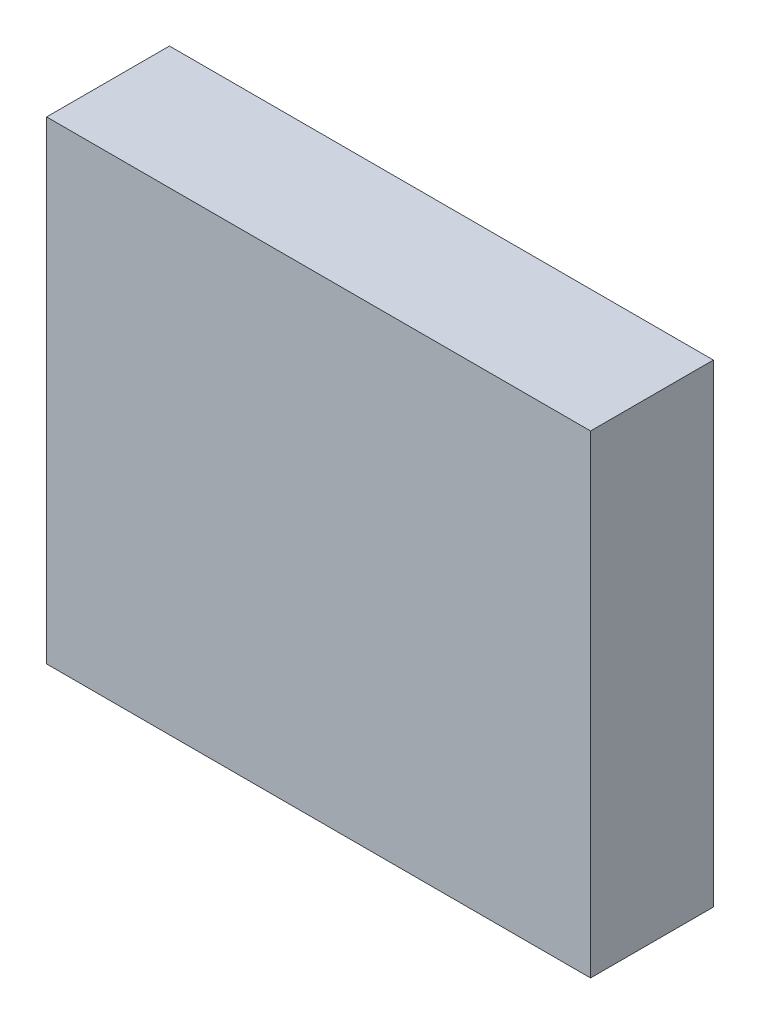
ISO-10303-21;
HEADER;
FILE_DESCRIPTION(('STEP AP214'),'2;1');
FILE_NAME('part.step','',(''),(''),'','','');
FILE_SCHEMA(('AUTOMOTIVE_DESIGN { 1 0 10303 214 1 1 1 1 }'));
ENDSEC;
DATA;
#1=APPLICATION_CONTEXT('core data for automotive mechanical design processes');
#2=APPLICATION_PROTOCOL_DEFINITION('international standard','automotive_design',2000,#1);
#3=PRODUCT_CONTEXT('',#1,'mechanical');
#4=PRODUCT('Part','Part','',(#3));
#5=PRODUCT_RELATED_PRODUCT_CATEGORY('part','',(#4));
#6=PRODUCT_DEFINITION_FORMATION('','',#4);
#7=PRODUCT_DEFINITION_CONTEXT('part definition',#1,'design');
#8=PRODUCT_DEFINITION('design','',#6,#7);
#9=PRODUCT_DEFINITION_SHAPE('','',#8);
#10=(LENGTH_UNIT() NAMED_UNIT(*) SI_UNIT(.MILLI.,.METRE.));
#11=(NAMED_UNIT(*) PLANE_ANGLE_UNIT() SI_UNIT($,.RADIAN.));
#12=(NAMED_UNIT(*) SI_UNIT($,.STERADIAN.) SOLID_ANGLE_UNIT());
#13=UNCERTAINTY_MEASURE_WITH_UNIT(LENGTH_MEASURE(1.E-05),#10,'distance_accuracy_value','');
#14=(GEOMETRIC_REPRESENTATION_CONTEXT(3) GLOBAL_UNCERTAINTY_ASSIGNED_CONTEXT((#13)) GLOBAL_UNIT_ASSIGNED_CONTEXT((#10,
#11,#12)) REPRESENTATION_CONTEXT('',''));
#15=CARTESIAN_POINT('',(0.,0.,0.));
#16=DIRECTION('',(0.,0.,1.));
#17=DIRECTION('',(1.,0.,0.));
#18=AXIS2_PLACEMENT_3D('',#15,#16,#17);
#19=CARTESIAN_POINT('',(155.,-135.,70.));
#20=DIRECTION('',(-1.,0.,0.));
#21=DIRECTION('',(0.,0.,1.));
#22=AXIS2_PLACEMENT_3D('',#19,#20,#21);
#23=PLANE('',#22);
#24=DIRECTION('',(0.,1.,0.));
#25=VECTOR('',#24,1.);
#26=CARTESIAN_POINT('',(155.,-135.,0.));
#27=LINE('',#26,#25);
#28=CARTESIAN_POINT('',(155.,-135.,0.));
#29=VERTEX_POINT('',#28);
#30=CARTESIAN_POINT('',(155.,135.,0.));
#31=VERTEX_POINT('',#30);
#32=EDGE_CURVE('E95',#29,#31,#27,.T.);
#33=ORIENTED_EDGE('',*,*,#32,.T.);
#34=DIRECTION('',(0.,0.,-1.));
#35=VECTOR('',#34,1.);
#36=CARTESIAN_POINT('',(155.,135.,70.));
#37=LINE('',#36,#35);
#38=CARTESIAN_POINT('',(155.,135.,70.));
#39=VERTEX_POINT('',#38);
#40=EDGE_CURVE('E11',#39,#31,#37,.T.);
#41=ORIENTED_EDGE('',*,*,#40,.F.);
#42=DIRECTION('',(0.,1.,0.));
#43=VECTOR('',#42,1.);
#44=CARTESIAN_POINT('',(155.,-135.,70.));
#45=LINE('',#44,#43);
#46=CARTESIAN_POINT('',(155.,-135.,70.));
#47=VERTEX_POINT('',#46);
#48=EDGE_CURVE('E83',#47,#39,#45,.T.);
#49=ORIENTED_EDGE('',*,*,#48,.F.);
#50=DIRECTION('',(0.,0.,-1.));
#51=VECTOR('',#50,1.);
#52=CARTESIAN_POINT('',(155.,-135.,70.));
#53=LINE('',#52,#51);
#54=EDGE_CURVE('E91',#47,#29,#53,.T.);
#55=ORIENTED_EDGE('',*,*,#54,.T.);
#56=EDGE_LOOP('',(#33,#41,#49,#55));
#57=FACE_BOUND('',#56,.T.);
#58=ADVANCED_FACE('F32',(#57),#23,.F.);
#59=CARTESIAN_POINT('',(-155.,135.,70.));
#60=DIRECTION('',(0.,-1.,0.));
#61=DIRECTION('',(0.,0.,-1.));
#62=AXIS2_PLACEMENT_3D('',#59,#60,#61);
#63=PLANE('',#62);
#64=DIRECTION('',(-1.,0.,0.));
#65=VECTOR('',#64,1.);
#66=CARTESIAN_POINT('',(-155.,135.,0.));
#67=LINE('',#66,#65);
#68=CARTESIAN_POINT('',(-155.,135.,0.));
#69=VERTEX_POINT('',#68);
#70=EDGE_CURVE('E87',#31,#69,#67,.T.);
#71=ORIENTED_EDGE('',*,*,#70,.T.);
#72=DIRECTION('',(0.,0.,-1.));
#73=VECTOR('',#72,1.);
#74=CARTESIAN_POINT('',(-155.,135.,70.));
#75=LINE('',#74,#73);
#76=CARTESIAN_POINT('',(-155.,135.,70.));
#77=VERTEX_POINT('',#76);
#78=EDGE_CURVE('E40',#77,#69,#75,.T.);
#79=ORIENTED_EDGE('',*,*,#78,.F.);
#80=DIRECTION('',(-1.,0.,0.));
#81=VECTOR('',#80,1.);
#82=CARTESIAN_POINT('',(-155.,135.,70.));
#83=LINE('',#82,#81);
#84=EDGE_CURVE('E78',#39,#77,#83,.T.);
#85=ORIENTED_EDGE('',*,*,#84,.F.);
#86=ORIENTED_EDGE('',*,*,#40,.T.);
#87=EDGE_LOOP('',(#71,#79,#85,#86));
#88=FACE_BOUND('',#87,.T.);
#89=ADVANCED_FACE('F86',(#88),#63,.F.);
#90=CARTESIAN_POINT('',(-155.,-135.,70.));
#91=DIRECTION('',(1.,0.,0.));
#92=DIRECTION('',(0.,0.,-1.));
#93=AXIS2_PLACEMENT_3D('',#90,#91,#92);
#94=PLANE('',#93);
#95=DIRECTION('',(0.,-1.,0.));
#96=VECTOR('',#95,1.);
#97=CARTESIAN_POINT('',(-155.,-135.,0.));
#98=LINE('',#97,#96);
#99=CARTESIAN_POINT('',(-155.,-135.,0.));
#100=VERTEX_POINT('',#99);
#101=EDGE_CURVE('E65',#69,#100,#98,.T.);
#102=ORIENTED_EDGE('',*,*,#101,.T.);
#103=DIRECTION('',(0.,0.,-1.));
#104=VECTOR('',#103,1.);
#105=CARTESIAN_POINT('',(-155.,-135.,70.));
#106=LINE('',#105,#104);
#107=CARTESIAN_POINT('',(-155.,-135.,70.));
#108=VERTEX_POINT('',#107);
#109=EDGE_CURVE('E88',#108,#100,#106,.T.);
#110=ORIENTED_EDGE('',*,*,#109,.F.);
#111=DIRECTION('',(0.,-1.,0.));
#112=VECTOR('',#111,1.);
#113=CARTESIAN_POINT('',(-155.,-135.,70.));
#114=LINE('',#113,#112);
#115=EDGE_CURVE('E81',#77,#108,#114,.T.);
#116=ORIENTED_EDGE('',*,*,#115,.F.);
#117=ORIENTED_EDGE('',*,*,#78,.T.);
#118=EDGE_LOOP('',(#102,#110,#116,#117));
#119=FACE_BOUND('',#118,.T.);
#120=ADVANCED_FACE('F89',(#119),#94,.F.);
#121=CARTESIAN_POINT('',(-155.,-135.,70.));
#122=DIRECTION('',(0.,1.,0.));
#123=DIRECTION('',(0.,0.,1.));
#124=AXIS2_PLACEMENT_3D('',#121,#122,#123);
#125=PLANE('',#124);
#126=DIRECTION('',(1.,0.,0.));
#127=VECTOR('',#126,1.);
#128=CARTESIAN_POINT('',(-155.,-135.,0.));
#129=LINE('',#128,#127);
#130=EDGE_CURVE('E71',#100,#29,#129,.T.);
#131=ORIENTED_EDGE('',*,*,#130,.T.);
#132=ORIENTED_EDGE('',*,*,#54,.F.);
#133=DIRECTION('',(1.,0.,0.));
#134=VECTOR('',#133,1.);
#135=CARTESIAN_POINT('',(-155.,-135.,70.));
#136=LINE('',#135,#134);
#137=EDGE_CURVE('E48',#108,#47,#136,.T.);
#138=ORIENTED_EDGE('',*,*,#137,.F.);
#139=ORIENTED_EDGE('',*,*,#109,.T.);
#140=EDGE_LOOP('',(#131,#132,#138,#139));
#141=FACE_BOUND('',#140,.T.);
#142=ADVANCED_FACE('F102',(#141),#125,.F.);
#143=CARTESIAN_POINT('',(0.,0.,70.));
#144=DIRECTION('',(0.,0.,-1.));
#145=DIRECTION('',(-1.,0.,0.));
#146=AXIS2_PLACEMENT_3D('',#143,#144,#145);
#147=PLANE('',#146);
#148=ORIENTED_EDGE('',*,*,#48,.T.);
#149=ORIENTED_EDGE('',*,*,#84,.T.);
#150=ORIENTED_EDGE('',*,*,#115,.T.);
#151=ORIENTED_EDGE('',*,*,#137,.T.);
#152=EDGE_LOOP('',(#148,#149,#150,#151));
#153=FACE_BOUND('',#152,.T.);
#154=ADVANCED_FACE('F79',(#153),#147,.F.);
#155=CARTESIAN_POINT('',(0.,0.,0.));
#156=DIRECTION('',(0.,0.,-1.));
#157=DIRECTION('',(-1.,0.,0.));
#158=AXIS2_PLACEMENT_3D('',#155,#156,#157);
#159=PLANE('',#158);
#160=ORIENTED_EDGE('',*,*,#32,.F.);
#161=ORIENTED_EDGE('',*,*,#130,.F.);
#162=ORIENTED_EDGE('',*,*,#101,.F.);
#163=ORIENTED_EDGE('',*,*,#70,.F.);
#164=EDGE_LOOP('',(#160,#161,#162,#163));
#165=FACE_BOUND('',#164,.T.);
#166=ADVANCED_FACE('F105',(#165),#159,.T.);
#167=CLOSED_SHELL('',(#58,#89,#120,#142,#154,#166));
#168=MANIFOLD_SOLID_BREP('B2',#167);
#169=ADVANCED_BREP_SHAPE_REPRESENTATION('',(#18,#168),#14);
#170=SHAPE_DEFINITION_REPRESENTATION(#9,#169);
ENDSEC;
END-ISO-10303-21;
